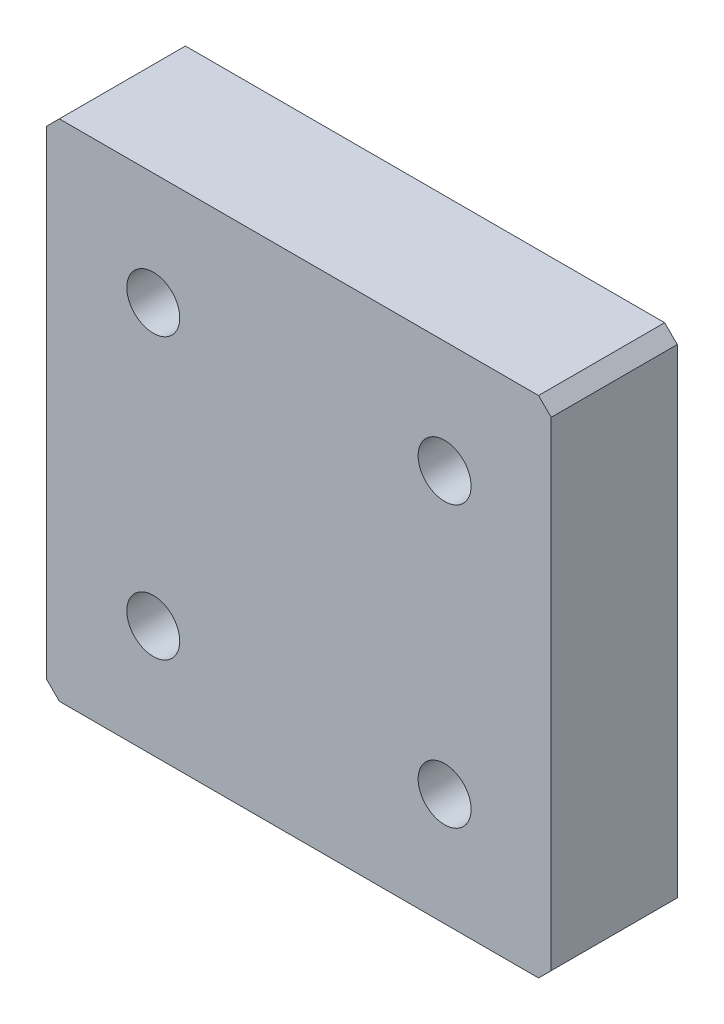
ISO-10303-21;
HEADER;
FILE_DESCRIPTION(('STEP AP214'),'2;1');
FILE_NAME('part.step','',(''),(''),'','','');
FILE_SCHEMA(('AUTOMOTIVE_DESIGN { 1 0 10303 214 1 1 1 1 }'));
ENDSEC;
DATA;
#1=APPLICATION_CONTEXT('core data for automotive mechanical design processes');
#2=APPLICATION_PROTOCOL_DEFINITION('international standard','automotive_design',2000,#1);
#3=PRODUCT_CONTEXT('',#1,'mechanical');
#4=PRODUCT('Part','Part','',(#3));
#5=PRODUCT_RELATED_PRODUCT_CATEGORY('part','',(#4));
#6=PRODUCT_DEFINITION_FORMATION('','',#4);
#7=PRODUCT_DEFINITION_CONTEXT('part definition',#1,'design');
#8=PRODUCT_DEFINITION('design','',#6,#7);
#9=PRODUCT_DEFINITION_SHAPE('','',#8);
#10=(LENGTH_UNIT() NAMED_UNIT(*) SI_UNIT(.MILLI.,.METRE.));
#11=(NAMED_UNIT(*) PLANE_ANGLE_UNIT() SI_UNIT($,.RADIAN.));
#12=(NAMED_UNIT(*) SI_UNIT($,.STERADIAN.) SOLID_ANGLE_UNIT());
#13=UNCERTAINTY_MEASURE_WITH_UNIT(LENGTH_MEASURE(1.E-05),#10,'distance_accuracy_value','');
#14=(GEOMETRIC_REPRESENTATION_CONTEXT(3) GLOBAL_UNCERTAINTY_ASSIGNED_CONTEXT((#13)) GLOBAL_UNIT_ASSIGNED_CONTEXT((#10,
#11,#12)) REPRESENTATION_CONTEXT('',''));
#15=CARTESIAN_POINT('',(0.,0.,0.));
#16=DIRECTION('',(0.,0.,1.));
#17=DIRECTION('',(1.,0.,0.));
#18=AXIS2_PLACEMENT_3D('',#15,#16,#17);
#19=CARTESIAN_POINT('',(-19.,-20.,10.));
#20=DIRECTION('',(0.70710678118655,0.707106781186545,0.));
#21=DIRECTION('',(-0.707106781186545,0.70710678118655,0.));
#22=AXIS2_PLACEMENT_3D('',#19,#20,#21);
#23=PLANE('',#22);
#24=DIRECTION('',(0.,0.,-1.));
#25=VECTOR('',#24,1.);
#26=CARTESIAN_POINT('',(-20.,-19.,10.));
#27=LINE('',#26,#25);
#28=CARTESIAN_POINT('',(-20.,-19.,10.));
#29=VERTEX_POINT('',#28);
#30=CARTESIAN_POINT('',(-20.,-19.,0.));
#31=VERTEX_POINT('',#30);
#32=EDGE_CURVE('E116',#29,#31,#27,.T.);
#33=ORIENTED_EDGE('',*,*,#32,.T.);
#34=DIRECTION('',(0.707106781186545,-0.70710678118655,0.));
#35=VECTOR('',#34,1.);
#36=CARTESIAN_POINT('',(-20.,-19.,0.));
#37=LINE('',#36,#35);
#38=CARTESIAN_POINT('',(-19.,-20.,0.));
#39=VERTEX_POINT('',#38);
#40=EDGE_CURVE('E130',#31,#39,#37,.T.);
#41=ORIENTED_EDGE('',*,*,#40,.T.);
#42=DIRECTION('',(0.,0.,1.));
#43=VECTOR('',#42,1.);
#44=CARTESIAN_POINT('',(-19.,-20.,10.));
#45=LINE('',#44,#43);
#46=CARTESIAN_POINT('',(-19.,-20.,10.));
#47=VERTEX_POINT('',#46);
#48=EDGE_CURVE('E260',#39,#47,#45,.T.);
#49=ORIENTED_EDGE('',*,*,#48,.T.);
#50=DIRECTION('',(-0.707106781186545,0.70710678118655,0.));
#51=VECTOR('',#50,1.);
#52=CARTESIAN_POINT('',(-19.,-20.,10.));
#53=LINE('',#52,#51);
#54=EDGE_CURVE('E160',#29,#47,#53,.F.);
#55=ORIENTED_EDGE('',*,*,#54,.F.);
#56=EDGE_LOOP('',(#33,#41,#49,#55));
#57=FACE_BOUND('',#56,.T.);
#58=ADVANCED_FACE('F44',(#57),#23,.F.);
#59=CARTESIAN_POINT('',(20.,-19.,10.));
#60=DIRECTION('',(-0.707106781186545,0.70710678118655,0.));
#61=DIRECTION('',(-0.70710678118655,-0.707106781186545,0.));
#62=AXIS2_PLACEMENT_3D('',#59,#60,#61);
#63=PLANE('',#62);
#64=DIRECTION('',(0.,0.,1.));
#65=VECTOR('',#64,1.);
#66=CARTESIAN_POINT('',(19.,-20.,10.));
#67=LINE('',#66,#65);
#68=CARTESIAN_POINT('',(19.,-20.,10.));
#69=VERTEX_POINT('',#68);
#70=CARTESIAN_POINT('',(19.,-20.,0.));
#71=VERTEX_POINT('',#70);
#72=EDGE_CURVE('E139',#69,#71,#67,.F.);
#73=ORIENTED_EDGE('',*,*,#72,.T.);
#74=DIRECTION('',(0.70710678118655,0.707106781186545,0.));
#75=VECTOR('',#74,1.);
#76=CARTESIAN_POINT('',(19.,-20.,0.));
#77=LINE('',#76,#75);
#78=CARTESIAN_POINT('',(20.,-19.,0.));
#79=VERTEX_POINT('',#78);
#80=EDGE_CURVE('E131',#71,#79,#77,.T.);
#81=ORIENTED_EDGE('',*,*,#80,.T.);
#82=DIRECTION('',(0.,0.,1.));
#83=VECTOR('',#82,1.);
#84=CARTESIAN_POINT('',(20.,-19.,10.));
#85=LINE('',#84,#83);
#86=CARTESIAN_POINT('',(20.,-19.,10.));
#87=VERTEX_POINT('',#86);
#88=EDGE_CURVE('E268',#79,#87,#85,.T.);
#89=ORIENTED_EDGE('',*,*,#88,.T.);
#90=DIRECTION('',(-0.70710678118655,-0.707106781186545,0.));
#91=VECTOR('',#90,1.);
#92=CARTESIAN_POINT('',(20.,-19.,10.));
#93=LINE('',#92,#91);
#94=EDGE_CURVE('E158',#69,#87,#93,.F.);
#95=ORIENTED_EDGE('',*,*,#94,.F.);
#96=EDGE_LOOP('',(#73,#81,#89,#95));
#97=FACE_BOUND('',#96,.T.);
#98=ADVANCED_FACE('F239',(#97),#63,.F.);
#99=CARTESIAN_POINT('',(-20.,19.,10.));
#100=DIRECTION('',(0.707106781186544,-0.707106781186551,0.));
#101=DIRECTION('',(0.707106781186551,0.707106781186544,0.));
#102=AXIS2_PLACEMENT_3D('',#99,#100,#101);
#103=PLANE('',#102);
#104=DIRECTION('',(0.,0.,1.));
#105=VECTOR('',#104,1.);
#106=CARTESIAN_POINT('',(-19.,20.,10.));
#107=LINE('',#106,#105);
#108=CARTESIAN_POINT('',(-19.,20.,10.));
#109=VERTEX_POINT('',#108);
#110=CARTESIAN_POINT('',(-19.,20.,0.));
#111=VERTEX_POINT('',#110);
#112=EDGE_CURVE('E127',#109,#111,#107,.F.);
#113=ORIENTED_EDGE('',*,*,#112,.T.);
#114=DIRECTION('',(-0.707106781186551,-0.707106781186544,0.));
#115=VECTOR('',#114,1.);
#116=CARTESIAN_POINT('',(-19.,20.,0.));
#117=LINE('',#116,#115);
#118=CARTESIAN_POINT('',(-20.,19.,0.));
#119=VERTEX_POINT('',#118);
#120=EDGE_CURVE('E121',#111,#119,#117,.T.);
#121=ORIENTED_EDGE('',*,*,#120,.T.);
#122=DIRECTION('',(0.,0.,-1.));
#123=VECTOR('',#122,1.);
#124=CARTESIAN_POINT('',(-20.,19.,10.));
#125=LINE('',#124,#123);
#126=CARTESIAN_POINT('',(-20.,19.,10.));
#127=VERTEX_POINT('',#126);
#128=EDGE_CURVE('E125',#119,#127,#125,.F.);
#129=ORIENTED_EDGE('',*,*,#128,.T.);
#130=DIRECTION('',(0.707106781186551,0.707106781186544,0.));
#131=VECTOR('',#130,1.);
#132=CARTESIAN_POINT('',(-20.,19.,10.));
#133=LINE('',#132,#131);
#134=EDGE_CURVE('E66',#109,#127,#133,.F.);
#135=ORIENTED_EDGE('',*,*,#134,.F.);
#136=EDGE_LOOP('',(#113,#121,#129,#135));
#137=FACE_BOUND('',#136,.T.);
#138=ADVANCED_FACE('F123',(#137),#103,.F.);
#139=CARTESIAN_POINT('',(0.,0.,0.));
#140=DIRECTION('',(0.,0.,1.));
#141=DIRECTION('',(1.,0.,0.));
#142=AXIS2_PLACEMENT_3D('',#139,#140,#141);
#143=PLANE('',#142);
#144=ORIENTED_EDGE('',*,*,#40,.F.);
#145=DIRECTION('',(0.,1.,0.));
#146=VECTOR('',#145,1.);
#147=CARTESIAN_POINT('',(-20.,-20.,0.));
#148=LINE('',#147,#146);
#149=EDGE_CURVE('E134',#31,#119,#148,.T.);
#150=ORIENTED_EDGE('',*,*,#149,.T.);
#151=ORIENTED_EDGE('',*,*,#120,.F.);
#152=DIRECTION('',(1.,0.,0.));
#153=VECTOR('',#152,1.);
#154=CARTESIAN_POINT('',(20.,20.,0.));
#155=LINE('',#154,#153);
#156=CARTESIAN_POINT('',(19.,20.,0.));
#157=VERTEX_POINT('',#156);
#158=EDGE_CURVE('E271',#111,#157,#155,.T.);
#159=ORIENTED_EDGE('',*,*,#158,.T.);
#160=DIRECTION('',(0.707106781186545,-0.70710678118655,0.));
#161=VECTOR('',#160,1.);
#162=CARTESIAN_POINT('',(19.,20.,0.));
#163=LINE('',#162,#161);
#164=CARTESIAN_POINT('',(20.,19.,0.));
#165=VERTEX_POINT('',#164);
#166=EDGE_CURVE('E153',#157,#165,#163,.T.);
#167=ORIENTED_EDGE('',*,*,#166,.T.);
#168=DIRECTION('',(0.,1.,0.));
#169=VECTOR('',#168,1.);
#170=CARTESIAN_POINT('',(20.,-20.,0.));
#171=LINE('',#170,#169);
#172=EDGE_CURVE('E257',#165,#79,#171,.F.);
#173=ORIENTED_EDGE('',*,*,#172,.T.);
#174=ORIENTED_EDGE('',*,*,#80,.F.);
#175=DIRECTION('',(-1.,0.,0.));
#176=VECTOR('',#175,1.);
#177=CARTESIAN_POINT('',(20.,-20.,0.));
#178=LINE('',#177,#176);
#179=EDGE_CURVE('E253',#71,#39,#178,.T.);
#180=ORIENTED_EDGE('',*,*,#179,.T.);
#181=EDGE_LOOP('',(#144,#150,#151,#159,#167,#173,#174,#180));
#182=FACE_BOUND('',#181,.T.);
#183=CARTESIAN_POINT('',(11.55,11.1,0.));
#184=DIRECTION('',(0.,0.,1.));
#185=DIRECTION('',(1.,0.,0.));
#186=AXIS2_PLACEMENT_3D('',#183,#184,#185);
#187=CIRCLE('',#186,2.09999999999999);
#188=CARTESIAN_POINT('',(13.65,11.1,0.));
#189=VERTEX_POINT('',#188);
#190=EDGE_CURVE('E144',#189,#189,#187,.T.);
#191=ORIENTED_EDGE('',*,*,#190,.T.);
#192=EDGE_LOOP('',(#191));
#193=FACE_BOUND('',#192,.T.);
#194=CARTESIAN_POINT('',(-11.55,11.1,0.));
#195=DIRECTION('',(0.,0.,1.));
#196=DIRECTION('',(1.,0.,0.));
#197=AXIS2_PLACEMENT_3D('',#194,#195,#196);
#198=CIRCLE('',#197,2.09999999999999);
#199=CARTESIAN_POINT('',(-9.45000000000005,11.1,0.));
#200=VERTEX_POINT('',#199);
#201=EDGE_CURVE('E148',#200,#200,#198,.T.);
#202=ORIENTED_EDGE('',*,*,#201,.T.);
#203=EDGE_LOOP('',(#202));
#204=FACE_BOUND('',#203,.T.);
#205=CARTESIAN_POINT('',(-11.55,-11.1,0.));
#206=DIRECTION('',(0.,0.,1.));
#207=DIRECTION('',(1.,0.,0.));
#208=AXIS2_PLACEMENT_3D('',#205,#206,#207);
#209=CIRCLE('',#208,2.09999999999999);
#210=CARTESIAN_POINT('',(-9.45000000000005,-11.1,0.));
#211=VERTEX_POINT('',#210);
#212=EDGE_CURVE('E176',#211,#211,#209,.T.);
#213=ORIENTED_EDGE('',*,*,#212,.T.);
#214=EDGE_LOOP('',(#213));
#215=FACE_BOUND('',#214,.T.);
#216=CARTESIAN_POINT('',(11.55,-11.1,0.));
#217=DIRECTION('',(0.,0.,1.));
#218=DIRECTION('',(1.,0.,0.));
#219=AXIS2_PLACEMENT_3D('',#216,#217,#218);
#220=CIRCLE('',#219,2.09999999999999);
#221=CARTESIAN_POINT('',(13.65,-11.1,0.));
#222=VERTEX_POINT('',#221);
#223=EDGE_CURVE('E47',#222,#222,#220,.T.);
#224=ORIENTED_EDGE('',*,*,#223,.T.);
#225=EDGE_LOOP('',(#224));
#226=FACE_BOUND('',#225,.T.);
#227=ADVANCED_FACE('F135',(#182,#193,#204,#215,#226),#143,.F.);
#228=CARTESIAN_POINT('',(19.,20.,10.));
#229=DIRECTION('',(-0.70710678118655,-0.707106781186545,0.));
#230=DIRECTION('',(0.707106781186545,-0.70710678118655,0.));
#231=AXIS2_PLACEMENT_3D('',#228,#229,#230);
#232=PLANE('',#231);
#233=DIRECTION('',(0.,0.,1.));
#234=VECTOR('',#233,1.);
#235=CARTESIAN_POINT('',(20.,19.,10.));
#236=LINE('',#235,#234);
#237=CARTESIAN_POINT('',(20.,19.,10.));
#238=VERTEX_POINT('',#237);
#239=EDGE_CURVE('E262',#238,#165,#236,.F.);
#240=ORIENTED_EDGE('',*,*,#239,.T.);
#241=ORIENTED_EDGE('',*,*,#166,.F.);
#242=DIRECTION('',(0.,0.,1.));
#243=VECTOR('',#242,1.);
#244=CARTESIAN_POINT('',(19.,20.,10.));
#245=LINE('',#244,#243);
#246=CARTESIAN_POINT('',(19.,20.,10.));
#247=VERTEX_POINT('',#246);
#248=EDGE_CURVE('E173',#157,#247,#245,.T.);
#249=ORIENTED_EDGE('',*,*,#248,.T.);
#250=DIRECTION('',(0.707106781186545,-0.70710678118655,0.));
#251=VECTOR('',#250,1.);
#252=CARTESIAN_POINT('',(19.,20.,10.));
#253=LINE('',#252,#251);
#254=EDGE_CURVE('E151',#238,#247,#253,.F.);
#255=ORIENTED_EDGE('',*,*,#254,.F.);
#256=EDGE_LOOP('',(#240,#241,#249,#255));
#257=FACE_BOUND('',#256,.T.);
#258=ADVANCED_FACE('F187',(#257),#232,.F.);
#259=CARTESIAN_POINT('',(11.55,-11.1,10.));
#260=DIRECTION('',(0.,0.,1.));
#261=DIRECTION('',(1.,0.,0.));
#262=AXIS2_PLACEMENT_3D('',#259,#260,#261);
#263=CYLINDRICAL_SURFACE('',#262,2.09999999999999);
#264=CARTESIAN_POINT('',(11.55,-11.1,10.));
#265=DIRECTION('',(0.,0.,1.));
#266=DIRECTION('',(1.,0.,0.));
#267=AXIS2_PLACEMENT_3D('',#264,#265,#266);
#268=CIRCLE('',#267,2.09999999999999);
#269=CARTESIAN_POINT('',(13.65,-11.1,10.));
#270=VERTEX_POINT('',#269);
#271=EDGE_CURVE('E171',#270,#270,#268,.F.);
#272=ORIENTED_EDGE('',*,*,#271,.F.);
#273=EDGE_LOOP('',(#272));
#274=FACE_BOUND('',#273,.T.);
#275=ORIENTED_EDGE('',*,*,#223,.F.);
#276=EDGE_LOOP('',(#275));
#277=FACE_BOUND('',#276,.T.);
#278=ADVANCED_FACE('F184',(#274,#277),#263,.F.);
#279=CARTESIAN_POINT('',(-11.55,-11.1,10.));
#280=DIRECTION('',(0.,0.,1.));
#281=DIRECTION('',(1.,0.,0.));
#282=AXIS2_PLACEMENT_3D('',#279,#280,#281);
#283=CYLINDRICAL_SURFACE('',#282,2.09999999999999);
#284=CARTESIAN_POINT('',(-11.55,-11.1,10.));
#285=DIRECTION('',(0.,0.,1.));
#286=DIRECTION('',(1.,0.,0.));
#287=AXIS2_PLACEMENT_3D('',#284,#285,#286);
#288=CIRCLE('',#287,2.09999999999999);
#289=CARTESIAN_POINT('',(-9.45000000000005,-11.1,10.));
#290=VERTEX_POINT('',#289);
#291=EDGE_CURVE('E168',#290,#290,#288,.F.);
#292=ORIENTED_EDGE('',*,*,#291,.F.);
#293=EDGE_LOOP('',(#292));
#294=FACE_BOUND('',#293,.T.);
#295=ORIENTED_EDGE('',*,*,#212,.F.);
#296=EDGE_LOOP('',(#295));
#297=FACE_BOUND('',#296,.T.);
#298=ADVANCED_FACE('F186',(#294,#297),#283,.F.);
#299=CARTESIAN_POINT('',(-11.55,11.1,10.));
#300=DIRECTION('',(0.,0.,1.));
#301=DIRECTION('',(1.,0.,0.));
#302=AXIS2_PLACEMENT_3D('',#299,#300,#301);
#303=CYLINDRICAL_SURFACE('',#302,2.09999999999999);
#304=CARTESIAN_POINT('',(-11.55,11.1,10.));
#305=DIRECTION('',(0.,0.,1.));
#306=DIRECTION('',(1.,0.,0.));
#307=AXIS2_PLACEMENT_3D('',#304,#305,#306);
#308=CIRCLE('',#307,2.09999999999999);
#309=CARTESIAN_POINT('',(-9.45000000000005,11.1,10.));
#310=VERTEX_POINT('',#309);
#311=EDGE_CURVE('E165',#310,#310,#308,.F.);
#312=ORIENTED_EDGE('',*,*,#311,.F.);
#313=EDGE_LOOP('',(#312));
#314=FACE_BOUND('',#313,.T.);
#315=ORIENTED_EDGE('',*,*,#201,.F.);
#316=EDGE_LOOP('',(#315));
#317=FACE_BOUND('',#316,.T.);
#318=ADVANCED_FACE('F194',(#314,#317),#303,.F.);
#319=CARTESIAN_POINT('',(11.55,11.1,10.));
#320=DIRECTION('',(0.,0.,1.));
#321=DIRECTION('',(1.,0.,0.));
#322=AXIS2_PLACEMENT_3D('',#319,#320,#321);
#323=CYLINDRICAL_SURFACE('',#322,2.09999999999999);
#324=CARTESIAN_POINT('',(11.55,11.1,10.));
#325=DIRECTION('',(0.,0.,1.));
#326=DIRECTION('',(1.,0.,0.));
#327=AXIS2_PLACEMENT_3D('',#324,#325,#326);
#328=CIRCLE('',#327,2.09999999999999);
#329=CARTESIAN_POINT('',(13.65,11.1,10.));
#330=VERTEX_POINT('',#329);
#331=EDGE_CURVE('E162',#330,#330,#328,.F.);
#332=ORIENTED_EDGE('',*,*,#331,.F.);
#333=EDGE_LOOP('',(#332));
#334=FACE_BOUND('',#333,.T.);
#335=ORIENTED_EDGE('',*,*,#190,.F.);
#336=EDGE_LOOP('',(#335));
#337=FACE_BOUND('',#336,.T.);
#338=ADVANCED_FACE('F222',(#334,#337),#323,.F.);
#339=CARTESIAN_POINT('',(-20.,-20.,10.));
#340=DIRECTION('',(1.,0.,0.));
#341=DIRECTION('',(0.,0.,-1.));
#342=AXIS2_PLACEMENT_3D('',#339,#340,#341);
#343=PLANE('',#342);
#344=ORIENTED_EDGE('',*,*,#32,.F.);
#345=DIRECTION('',(0.,1.,0.));
#346=VECTOR('',#345,1.);
#347=CARTESIAN_POINT('',(-20.,0.,10.));
#348=LINE('',#347,#346);
#349=EDGE_CURVE('E143',#127,#29,#348,.F.);
#350=ORIENTED_EDGE('',*,*,#349,.F.);
#351=ORIENTED_EDGE('',*,*,#128,.F.);
#352=ORIENTED_EDGE('',*,*,#149,.F.);
#353=EDGE_LOOP('',(#344,#350,#351,#352));
#354=FACE_BOUND('',#353,.T.);
#355=ADVANCED_FACE('F141',(#354),#343,.F.);
#356=CARTESIAN_POINT('',(20.,-20.,10.));
#357=DIRECTION('',(0.,1.,0.));
#358=DIRECTION('',(-1.,0.,0.));
#359=AXIS2_PLACEMENT_3D('',#356,#357,#358);
#360=PLANE('',#359);
#361=ORIENTED_EDGE('',*,*,#48,.F.);
#362=ORIENTED_EDGE('',*,*,#179,.F.);
#363=ORIENTED_EDGE('',*,*,#72,.F.);
#364=DIRECTION('',(1.,0.,0.));
#365=VECTOR('',#364,1.);
#366=CARTESIAN_POINT('',(0.,-20.,10.));
#367=LINE('',#366,#365);
#368=EDGE_CURVE('E276',#47,#69,#367,.T.);
#369=ORIENTED_EDGE('',*,*,#368,.F.);
#370=EDGE_LOOP('',(#361,#362,#363,#369));
#371=FACE_BOUND('',#370,.T.);
#372=ADVANCED_FACE('F215',(#371),#360,.F.);
#373=CARTESIAN_POINT('',(20.,-20.,10.));
#374=DIRECTION('',(-1.,0.,0.));
#375=DIRECTION('',(0.,0.,1.));
#376=AXIS2_PLACEMENT_3D('',#373,#374,#375);
#377=PLANE('',#376);
#378=ORIENTED_EDGE('',*,*,#88,.F.);
#379=ORIENTED_EDGE('',*,*,#172,.F.);
#380=ORIENTED_EDGE('',*,*,#239,.F.);
#381=DIRECTION('',(0.,1.,0.));
#382=VECTOR('',#381,1.);
#383=CARTESIAN_POINT('',(20.,0.,10.));
#384=LINE('',#383,#382);
#385=EDGE_CURVE('E53',#87,#238,#384,.T.);
#386=ORIENTED_EDGE('',*,*,#385,.F.);
#387=EDGE_LOOP('',(#378,#379,#380,#386));
#388=FACE_BOUND('',#387,.T.);
#389=ADVANCED_FACE('F208',(#388),#377,.F.);
#390=CARTESIAN_POINT('',(20.,20.,10.));
#391=DIRECTION('',(0.,-1.,0.));
#392=DIRECTION('',(1.,0.,0.));
#393=AXIS2_PLACEMENT_3D('',#390,#391,#392);
#394=PLANE('',#393);
#395=ORIENTED_EDGE('',*,*,#248,.F.);
#396=ORIENTED_EDGE('',*,*,#158,.F.);
#397=ORIENTED_EDGE('',*,*,#112,.F.);
#398=DIRECTION('',(1.,0.,0.));
#399=VECTOR('',#398,1.);
#400=CARTESIAN_POINT('',(0.,20.,10.));
#401=LINE('',#400,#399);
#402=EDGE_CURVE('E11',#247,#109,#401,.F.);
#403=ORIENTED_EDGE('',*,*,#402,.F.);
#404=EDGE_LOOP('',(#395,#396,#397,#403));
#405=FACE_BOUND('',#404,.T.);
#406=ADVANCED_FACE('F202',(#405),#394,.F.);
#407=CARTESIAN_POINT('',(0.,0.,10.));
#408=DIRECTION('',(0.,0.,1.));
#409=DIRECTION('',(1.,0.,0.));
#410=AXIS2_PLACEMENT_3D('',#407,#408,#409);
#411=PLANE('',#410);
#412=ORIENTED_EDGE('',*,*,#402,.T.);
#413=ORIENTED_EDGE('',*,*,#134,.T.);
#414=ORIENTED_EDGE('',*,*,#349,.T.);
#415=ORIENTED_EDGE('',*,*,#54,.T.);
#416=ORIENTED_EDGE('',*,*,#368,.T.);
#417=ORIENTED_EDGE('',*,*,#94,.T.);
#418=ORIENTED_EDGE('',*,*,#385,.T.);
#419=ORIENTED_EDGE('',*,*,#254,.T.);
#420=EDGE_LOOP('',(#412,#413,#414,#415,#416,#417,#418,#419));
#421=FACE_BOUND('',#420,.T.);
#422=ORIENTED_EDGE('',*,*,#331,.T.);
#423=EDGE_LOOP('',(#422));
#424=FACE_BOUND('',#423,.T.);
#425=ORIENTED_EDGE('',*,*,#311,.T.);
#426=EDGE_LOOP('',(#425));
#427=FACE_BOUND('',#426,.T.);
#428=ORIENTED_EDGE('',*,*,#291,.T.);
#429=EDGE_LOOP('',(#428));
#430=FACE_BOUND('',#429,.T.);
#431=ORIENTED_EDGE('',*,*,#271,.T.);
#432=EDGE_LOOP('',(#431));
#433=FACE_BOUND('',#432,.T.);
#434=ADVANCED_FACE('F200',(#421,#424,#427,#430,#433),#411,.T.);
#435=CLOSED_SHELL('',(#58,#98,#138,#227,#258,#278,#298,#318,#338,#355,#372,#389,#406,#434));
#436=MANIFOLD_SOLID_BREP('B2',#435);
#437=ADVANCED_BREP_SHAPE_REPRESENTATION('',(#18,#436),#14);
#438=SHAPE_DEFINITION_REPRESENTATION(#9,#437);
ENDSEC;
END-ISO-10303-21;
